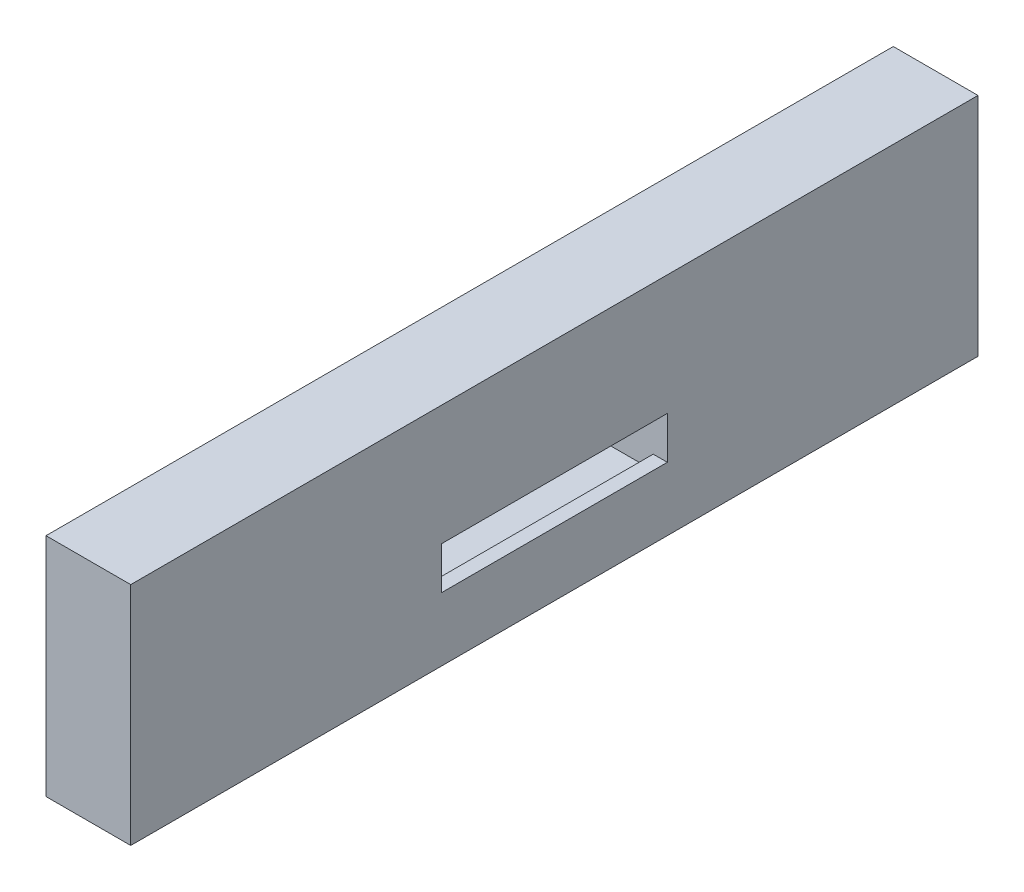
ISO-10303-21;
HEADER;
FILE_DESCRIPTION(('STEP AP214'),'2;1');
FILE_NAME('part.step','',(''),(''),'','','');
FILE_SCHEMA(('AUTOMOTIVE_DESIGN { 1 0 10303 214 1 1 1 1 }'));
ENDSEC;
DATA;
#1=APPLICATION_CONTEXT('core data for automotive mechanical design processes');
#2=APPLICATION_PROTOCOL_DEFINITION('international standard','automotive_design',2000,#1);
#3=PRODUCT_CONTEXT('',#1,'mechanical');
#4=PRODUCT('Part','Part','',(#3));
#5=PRODUCT_RELATED_PRODUCT_CATEGORY('part','',(#4));
#6=PRODUCT_DEFINITION_FORMATION('','',#4);
#7=PRODUCT_DEFINITION_CONTEXT('part definition',#1,'design');
#8=PRODUCT_DEFINITION('design','',#6,#7);
#9=PRODUCT_DEFINITION_SHAPE('','',#8);
#10=(LENGTH_UNIT() NAMED_UNIT(*) SI_UNIT(.MILLI.,.METRE.));
#11=(NAMED_UNIT(*) PLANE_ANGLE_UNIT() SI_UNIT($,.RADIAN.));
#12=(NAMED_UNIT(*) SI_UNIT($,.STERADIAN.) SOLID_ANGLE_UNIT());
#13=UNCERTAINTY_MEASURE_WITH_UNIT(LENGTH_MEASURE(1.E-05),#10,'distance_accuracy_value','');
#14=(GEOMETRIC_REPRESENTATION_CONTEXT(3) GLOBAL_UNCERTAINTY_ASSIGNED_CONTEXT((#13)) GLOBAL_UNIT_ASSIGNED_CONTEXT((#10,
#11,#12)) REPRESENTATION_CONTEXT('',''));
#15=CARTESIAN_POINT('',(0.,0.,0.));
#16=DIRECTION('',(0.,0.,1.));
#17=DIRECTION('',(1.,0.,0.));
#18=AXIS2_PLACEMENT_3D('',#15,#16,#17);
#19=CARTESIAN_POINT('',(63.5,0.,0.));
#20=DIRECTION('',(1.,0.,0.));
#21=DIRECTION('',(0.,0.,-1.));
#22=AXIS2_PLACEMENT_3D('',#19,#20,#21);
#23=PLANE('',#22);
#24=DIRECTION('',(0.,0.,1.));
#25=VECTOR('',#24,1.);
#26=CARTESIAN_POINT('',(63.5,57.15,-482.6));
#27=LINE('',#26,#25);
#28=CARTESIAN_POINT('',(63.5,57.15,-482.6));
#29=VERTEX_POINT('',#28);
#30=CARTESIAN_POINT('',(63.5,57.15,-279.4));
#31=VERTEX_POINT('',#30);
#32=EDGE_CURVE('E177',#29,#31,#27,.T.);
#33=ORIENTED_EDGE('',*,*,#32,.F.);
#34=DIRECTION('',(0.,-1.,0.));
#35=VECTOR('',#34,1.);
#36=CARTESIAN_POINT('',(63.5,44.45,-482.6));
#37=LINE('',#36,#35);
#38=CARTESIAN_POINT('',(63.5,44.45,-482.6));
#39=VERTEX_POINT('',#38);
#40=EDGE_CURVE('E152',#29,#39,#37,.T.);
#41=ORIENTED_EDGE('',*,*,#40,.T.);
#42=DIRECTION('',(0.,0.,1.));
#43=VECTOR('',#42,1.);
#44=CARTESIAN_POINT('',(63.5,44.45,-482.6));
#45=LINE('',#44,#43);
#46=CARTESIAN_POINT('',(63.5,44.45,-279.4));
#47=VERTEX_POINT('',#46);
#48=EDGE_CURVE('E198',#39,#47,#45,.T.);
#49=ORIENTED_EDGE('',*,*,#48,.T.);
#50=DIRECTION('',(0.,1.,0.));
#51=VECTOR('',#50,1.);
#52=CARTESIAN_POINT('',(63.5,44.45,-279.4));
#53=LINE('',#52,#51);
#54=EDGE_CURVE('E203',#47,#31,#53,.T.);
#55=ORIENTED_EDGE('',*,*,#54,.T.);
#56=EDGE_LOOP('',(#33,#41,#49,#55));
#57=FACE_BOUND('',#56,.T.);
#58=ADVANCED_FACE('F42',(#57),#23,.F.);
#59=CARTESIAN_POINT('',(63.5,95.25,-279.4));
#60=VERTEX_POINT('',#59);
#61=CARTESIAN_POINT('',(63.5,114.3,-279.4));
#62=VERTEX_POINT('',#61);
#63=EDGE_CURVE('E202',#60,#62,#53,.T.);
#64=ORIENTED_EDGE('',*,*,#63,.T.);
#65=CARTESIAN_POINT('',(63.5,114.3,-304.8));
#66=DIRECTION('',(1.,0.,0.));
#67=DIRECTION('',(0.,0.,-1.));
#68=AXIS2_PLACEMENT_3D('',#65,#66,#67);
#69=CIRCLE('',#68,25.4);
#70=CARTESIAN_POINT('',(63.5,139.7,-304.8));
#71=VERTEX_POINT('',#70);
#72=EDGE_CURVE('E285',#62,#71,#69,.F.);
#73=ORIENTED_EDGE('',*,*,#72,.T.);
#74=DIRECTION('',(0.,0.,-1.));
#75=VECTOR('',#74,1.);
#76=CARTESIAN_POINT('',(63.5,139.7,-482.6));
#77=LINE('',#76,#75);
#78=CARTESIAN_POINT('',(63.5,139.7,-457.2));
#79=VERTEX_POINT('',#78);
#80=EDGE_CURVE('E207',#71,#79,#77,.T.);
#81=ORIENTED_EDGE('',*,*,#80,.T.);
#82=CARTESIAN_POINT('',(63.5,114.3,-457.2));
#83=DIRECTION('',(1.,0.,0.));
#84=DIRECTION('',(0.,0.,-1.));
#85=AXIS2_PLACEMENT_3D('',#82,#83,#84);
#86=CIRCLE('',#85,25.4);
#87=CARTESIAN_POINT('',(63.5,114.3,-482.6));
#88=VERTEX_POINT('',#87);
#89=EDGE_CURVE('E64',#79,#88,#86,.F.);
#90=ORIENTED_EDGE('',*,*,#89,.T.);
#91=CARTESIAN_POINT('',(63.5,95.25,-482.6));
#92=VERTEX_POINT('',#91);
#93=EDGE_CURVE('E195',#88,#92,#37,.T.);
#94=ORIENTED_EDGE('',*,*,#93,.T.);
#95=DIRECTION('',(0.,0.,-1.));
#96=VECTOR('',#95,1.);
#97=CARTESIAN_POINT('',(63.5,95.25,-482.6));
#98=LINE('',#97,#96);
#99=EDGE_CURVE('E173',#60,#92,#98,.T.);
#100=ORIENTED_EDGE('',*,*,#99,.F.);
#101=EDGE_LOOP('',(#64,#73,#81,#90,#94,#100));
#102=FACE_BOUND('',#101,.T.);
#103=ADVANCED_FACE('F309',(#102),#23,.F.);
#104=CARTESIAN_POINT('',(76.2,0.,0.));
#105=DIRECTION('',(0.,0.,-1.));
#106=DIRECTION('',(-1.,0.,0.));
#107=AXIS2_PLACEMENT_3D('',#104,#105,#106);
#108=PLANE('',#107);
#109=DIRECTION('',(0.,-1.,0.));
#110=VECTOR('',#109,1.);
#111=CARTESIAN_POINT('',(0.,0.,0.));
#112=LINE('',#111,#110);
#113=CARTESIAN_POINT('',(0.,203.2,0.));
#114=VERTEX_POINT('',#113);
#115=CARTESIAN_POINT('',(0.,0.,0.));
#116=VERTEX_POINT('',#115);
#117=EDGE_CURVE('E228',#114,#116,#112,.T.);
#118=ORIENTED_EDGE('',*,*,#117,.T.);
#119=DIRECTION('',(-1.,0.,0.));
#120=VECTOR('',#119,1.);
#121=CARTESIAN_POINT('',(76.2,0.,0.));
#122=LINE('',#121,#120);
#123=CARTESIAN_POINT('',(76.2,0.,0.));
#124=VERTEX_POINT('',#123);
#125=EDGE_CURVE('E269',#124,#116,#122,.T.);
#126=ORIENTED_EDGE('',*,*,#125,.F.);
#127=DIRECTION('',(0.,-1.,0.));
#128=VECTOR('',#127,1.);
#129=CARTESIAN_POINT('',(76.2,0.,0.));
#130=LINE('',#129,#128);
#131=CARTESIAN_POINT('',(76.2,203.2,0.));
#132=VERTEX_POINT('',#131);
#133=EDGE_CURVE('E232',#132,#124,#130,.T.);
#134=ORIENTED_EDGE('',*,*,#133,.F.);
#135=DIRECTION('',(-1.,0.,0.));
#136=VECTOR('',#135,1.);
#137=CARTESIAN_POINT('',(76.2,203.2,0.));
#138=LINE('',#137,#136);
#139=EDGE_CURVE('E246',#132,#114,#138,.T.);
#140=ORIENTED_EDGE('',*,*,#139,.T.);
#141=EDGE_LOOP('',(#118,#126,#134,#140));
#142=FACE_BOUND('',#141,.T.);
#143=ADVANCED_FACE('F335',(#142),#108,.F.);
#144=CARTESIAN_POINT('',(76.2,0.,0.));
#145=DIRECTION('',(0.,1.,0.));
#146=DIRECTION('',(0.,0.,1.));
#147=AXIS2_PLACEMENT_3D('',#144,#145,#146);
#148=PLANE('',#147);
#149=DIRECTION('',(0.,0.,-1.));
#150=VECTOR('',#149,1.);
#151=CARTESIAN_POINT('',(0.,0.,0.));
#152=LINE('',#151,#150);
#153=CARTESIAN_POINT('',(0.,0.,-762.));
#154=VERTEX_POINT('',#153);
#155=EDGE_CURVE('E250',#116,#154,#152,.T.);
#156=ORIENTED_EDGE('',*,*,#155,.T.);
#157=DIRECTION('',(-1.,0.,0.));
#158=VECTOR('',#157,1.);
#159=CARTESIAN_POINT('',(76.2,0.,-762.));
#160=LINE('',#159,#158);
#161=CARTESIAN_POINT('',(76.2,0.,-762.));
#162=VERTEX_POINT('',#161);
#163=EDGE_CURVE('E265',#162,#154,#160,.T.);
#164=ORIENTED_EDGE('',*,*,#163,.F.);
#165=DIRECTION('',(0.,0.,-1.));
#166=VECTOR('',#165,1.);
#167=CARTESIAN_POINT('',(76.2,0.,0.));
#168=LINE('',#167,#166);
#169=EDGE_CURVE('E236',#124,#162,#168,.T.);
#170=ORIENTED_EDGE('',*,*,#169,.F.);
#171=ORIENTED_EDGE('',*,*,#125,.T.);
#172=EDGE_LOOP('',(#156,#164,#170,#171));
#173=FACE_BOUND('',#172,.T.);
#174=ADVANCED_FACE('F354',(#173),#148,.F.);
#175=CARTESIAN_POINT('',(76.2,0.,-762.));
#176=DIRECTION('',(0.,0.,1.));
#177=DIRECTION('',(0.,-1.,0.));
#178=AXIS2_PLACEMENT_3D('',#175,#176,#177);
#179=PLANE('',#178);
#180=DIRECTION('',(0.,1.,0.));
#181=VECTOR('',#180,1.);
#182=CARTESIAN_POINT('',(0.,0.,-762.));
#183=LINE('',#182,#181);
#184=CARTESIAN_POINT('',(0.,203.2,-762.));
#185=VERTEX_POINT('',#184);
#186=EDGE_CURVE('E253',#154,#185,#183,.T.);
#187=ORIENTED_EDGE('',*,*,#186,.T.);
#188=DIRECTION('',(-1.,0.,0.));
#189=VECTOR('',#188,1.);
#190=CARTESIAN_POINT('',(76.2,203.2,-762.));
#191=LINE('',#190,#189);
#192=CARTESIAN_POINT('',(76.2,203.2,-762.));
#193=VERTEX_POINT('',#192);
#194=EDGE_CURVE('E261',#193,#185,#191,.T.);
#195=ORIENTED_EDGE('',*,*,#194,.F.);
#196=DIRECTION('',(0.,1.,0.));
#197=VECTOR('',#196,1.);
#198=CARTESIAN_POINT('',(76.2,0.,-762.));
#199=LINE('',#198,#197);
#200=EDGE_CURVE('E240',#162,#193,#199,.T.);
#201=ORIENTED_EDGE('',*,*,#200,.F.);
#202=ORIENTED_EDGE('',*,*,#163,.T.);
#203=EDGE_LOOP('',(#187,#195,#201,#202));
#204=FACE_BOUND('',#203,.T.);
#205=ADVANCED_FACE('F350',(#204),#179,.F.);
#206=CARTESIAN_POINT('',(76.2,203.2,0.));
#207=DIRECTION('',(0.,-1.,0.));
#208=DIRECTION('',(0.,0.,-1.));
#209=AXIS2_PLACEMENT_3D('',#206,#207,#208);
#210=PLANE('',#209);
#211=DIRECTION('',(0.,0.,1.));
#212=VECTOR('',#211,1.);
#213=CARTESIAN_POINT('',(0.,203.2,0.));
#214=LINE('',#213,#212);
#215=EDGE_CURVE('E237',#185,#114,#214,.T.);
#216=ORIENTED_EDGE('',*,*,#215,.T.);
#217=ORIENTED_EDGE('',*,*,#139,.F.);
#218=DIRECTION('',(0.,0.,1.));
#219=VECTOR('',#218,1.);
#220=CARTESIAN_POINT('',(76.2,203.2,0.));
#221=LINE('',#220,#219);
#222=EDGE_CURVE('E243',#193,#132,#221,.T.);
#223=ORIENTED_EDGE('',*,*,#222,.F.);
#224=ORIENTED_EDGE('',*,*,#194,.T.);
#225=EDGE_LOOP('',(#216,#217,#223,#224));
#226=FACE_BOUND('',#225,.T.);
#227=ADVANCED_FACE('F345',(#226),#210,.F.);
#228=CARTESIAN_POINT('',(76.2,0.,0.));
#229=DIRECTION('',(-1.,0.,0.));
#230=DIRECTION('',(0.,0.,1.));
#231=AXIS2_PLACEMENT_3D('',#228,#229,#230);
#232=PLANE('',#231);
#233=DIRECTION('',(0.,0.,-1.));
#234=VECTOR('',#233,1.);
#235=CARTESIAN_POINT('',(76.2,95.25,-482.6));
#236=LINE('',#235,#234);
#237=CARTESIAN_POINT('',(76.2,95.25,-279.4));
#238=VERTEX_POINT('',#237);
#239=CARTESIAN_POINT('',(76.2,95.25,-482.6));
#240=VERTEX_POINT('',#239);
#241=EDGE_CURVE('E158',#238,#240,#236,.T.);
#242=ORIENTED_EDGE('',*,*,#241,.T.);
#243=DIRECTION('',(0.,-1.,0.));
#244=VECTOR('',#243,1.);
#245=CARTESIAN_POINT('',(76.2,95.25,-482.6));
#246=LINE('',#245,#244);
#247=CARTESIAN_POINT('',(76.2,57.15,-482.6));
#248=VERTEX_POINT('',#247);
#249=EDGE_CURVE('E149',#240,#248,#246,.T.);
#250=ORIENTED_EDGE('',*,*,#249,.T.);
#251=DIRECTION('',(0.,0.,1.));
#252=VECTOR('',#251,1.);
#253=CARTESIAN_POINT('',(76.2,57.15,-482.6));
#254=LINE('',#253,#252);
#255=CARTESIAN_POINT('',(76.2,57.15,-279.4));
#256=VERTEX_POINT('',#255);
#257=EDGE_CURVE('E162',#248,#256,#254,.T.);
#258=ORIENTED_EDGE('',*,*,#257,.T.);
#259=DIRECTION('',(0.,1.,0.));
#260=VECTOR('',#259,1.);
#261=CARTESIAN_POINT('',(76.2,95.25,-279.4));
#262=LINE('',#261,#260);
#263=EDGE_CURVE('E167',#256,#238,#262,.T.);
#264=ORIENTED_EDGE('',*,*,#263,.T.);
#265=EDGE_LOOP('',(#242,#250,#258,#264));
#266=FACE_BOUND('',#265,.T.);
#267=ORIENTED_EDGE('',*,*,#133,.T.);
#268=ORIENTED_EDGE('',*,*,#169,.T.);
#269=ORIENTED_EDGE('',*,*,#200,.T.);
#270=ORIENTED_EDGE('',*,*,#222,.T.);
#271=EDGE_LOOP('',(#267,#268,#269,#270));
#272=FACE_BOUND('',#271,.T.);
#273=ADVANCED_FACE('F169',(#266,#272),#232,.F.);
#274=CARTESIAN_POINT('',(0.,0.,0.));
#275=DIRECTION('',(-1.,0.,0.));
#276=DIRECTION('',(0.,0.,1.));
#277=AXIS2_PLACEMENT_3D('',#274,#275,#276);
#278=PLANE('',#277);
#279=DIRECTION('',(0.,-1.,0.));
#280=VECTOR('',#279,1.);
#281=CARTESIAN_POINT('',(0.,44.45,-482.6));
#282=LINE('',#281,#280);
#283=CARTESIAN_POINT('',(0.,114.3,-482.6));
#284=VERTEX_POINT('',#283);
#285=CARTESIAN_POINT('',(0.,44.45,-482.6));
#286=VERTEX_POINT('',#285);
#287=EDGE_CURVE('E189',#284,#286,#282,.T.);
#288=ORIENTED_EDGE('',*,*,#287,.F.);
#289=CARTESIAN_POINT('',(0.,114.3,-457.2));
#290=DIRECTION('',(-1.,0.,0.));
#291=DIRECTION('',(0.,0.,1.));
#292=AXIS2_PLACEMENT_3D('',#289,#290,#291);
#293=CIRCLE('',#292,25.4);
#294=CARTESIAN_POINT('',(0.,139.7,-457.2));
#295=VERTEX_POINT('',#294);
#296=EDGE_CURVE('E11',#284,#295,#293,.F.);
#297=ORIENTED_EDGE('',*,*,#296,.T.);
#298=DIRECTION('',(0.,0.,-1.));
#299=VECTOR('',#298,1.);
#300=CARTESIAN_POINT('',(0.,139.7,-482.6));
#301=LINE('',#300,#299);
#302=CARTESIAN_POINT('',(0.,139.7,-304.8));
#303=VERTEX_POINT('',#302);
#304=EDGE_CURVE('E221',#303,#295,#301,.T.);
#305=ORIENTED_EDGE('',*,*,#304,.F.);
#306=CARTESIAN_POINT('',(0.,114.3,-304.8));
#307=DIRECTION('',(-1.,0.,0.));
#308=DIRECTION('',(0.,0.,1.));
#309=AXIS2_PLACEMENT_3D('',#306,#307,#308);
#310=CIRCLE('',#309,25.4);
#311=CARTESIAN_POINT('',(0.,114.3,-279.4));
#312=VERTEX_POINT('',#311);
#313=EDGE_CURVE('E51',#303,#312,#310,.F.);
#314=ORIENTED_EDGE('',*,*,#313,.T.);
#315=DIRECTION('',(0.,1.,0.));
#316=VECTOR('',#315,1.);
#317=CARTESIAN_POINT('',(0.,44.45,-279.4));
#318=LINE('',#317,#316);
#319=CARTESIAN_POINT('',(0.,44.45,-279.4));
#320=VERTEX_POINT('',#319);
#321=EDGE_CURVE('E217',#320,#312,#318,.T.);
#322=ORIENTED_EDGE('',*,*,#321,.F.);
#323=DIRECTION('',(0.,0.,1.));
#324=VECTOR('',#323,1.);
#325=CARTESIAN_POINT('',(0.,44.45,-482.6));
#326=LINE('',#325,#324);
#327=EDGE_CURVE('E213',#286,#320,#326,.T.);
#328=ORIENTED_EDGE('',*,*,#327,.F.);
#329=EDGE_LOOP('',(#288,#297,#305,#314,#322,#328));
#330=FACE_BOUND('',#329,.T.);
#331=ORIENTED_EDGE('',*,*,#117,.F.);
#332=ORIENTED_EDGE('',*,*,#215,.F.);
#333=ORIENTED_EDGE('',*,*,#186,.F.);
#334=ORIENTED_EDGE('',*,*,#155,.F.);
#335=EDGE_LOOP('',(#331,#332,#333,#334));
#336=FACE_BOUND('',#335,.T.);
#337=ADVANCED_FACE('F295',(#330,#336),#278,.T.);
#338=CARTESIAN_POINT('',(63.5,44.45,-482.6));
#339=DIRECTION('',(0.,0.,-1.));
#340=DIRECTION('',(-1.,0.,0.));
#341=AXIS2_PLACEMENT_3D('',#338,#339,#340);
#342=PLANE('',#341);
#343=ORIENTED_EDGE('',*,*,#93,.F.);
#344=DIRECTION('',(-1.,0.,0.));
#345=VECTOR('',#344,1.);
#346=CARTESIAN_POINT('',(0.,114.3,-482.6));
#347=LINE('',#346,#345);
#348=EDGE_CURVE('E288',#88,#284,#347,.T.);
#349=ORIENTED_EDGE('',*,*,#348,.T.);
#350=ORIENTED_EDGE('',*,*,#287,.T.);
#351=DIRECTION('',(-1.,0.,0.));
#352=VECTOR('',#351,1.);
#353=CARTESIAN_POINT('',(63.5,44.45,-482.6));
#354=LINE('',#353,#352);
#355=EDGE_CURVE('E210',#39,#286,#354,.T.);
#356=ORIENTED_EDGE('',*,*,#355,.F.);
#357=ORIENTED_EDGE('',*,*,#40,.F.);
#358=DIRECTION('',(-1.,0.,0.));
#359=VECTOR('',#358,1.);
#360=CARTESIAN_POINT('',(76.2,57.15,-482.6));
#361=LINE('',#360,#359);
#362=EDGE_CURVE('E144',#248,#29,#361,.T.);
#363=ORIENTED_EDGE('',*,*,#362,.F.);
#364=ORIENTED_EDGE('',*,*,#249,.F.);
#365=DIRECTION('',(-1.,0.,0.));
#366=VECTOR('',#365,1.);
#367=CARTESIAN_POINT('',(76.2,95.25,-482.6));
#368=LINE('',#367,#366);
#369=EDGE_CURVE('E186',#240,#92,#368,.T.);
#370=ORIENTED_EDGE('',*,*,#369,.T.);
#371=EDGE_LOOP('',(#343,#349,#350,#356,#357,#363,#364,#370));
#372=FACE_BOUND('',#371,.T.);
#373=ADVANCED_FACE('F146',(#372),#342,.F.);
#374=CARTESIAN_POINT('',(63.5,139.7,-482.6));
#375=DIRECTION('',(0.,1.,0.));
#376=DIRECTION('',(0.,0.,1.));
#377=AXIS2_PLACEMENT_3D('',#374,#375,#376);
#378=PLANE('',#377);
#379=ORIENTED_EDGE('',*,*,#80,.F.);
#380=DIRECTION('',(-1.,0.,0.));
#381=VECTOR('',#380,1.);
#382=CARTESIAN_POINT('',(0.,139.7,-304.8));
#383=LINE('',#382,#381);
#384=EDGE_CURVE('E276',#71,#303,#383,.T.);
#385=ORIENTED_EDGE('',*,*,#384,.T.);
#386=ORIENTED_EDGE('',*,*,#304,.T.);
#387=DIRECTION('',(-1.,0.,0.));
#388=VECTOR('',#387,1.);
#389=CARTESIAN_POINT('',(63.5,139.7,-457.2));
#390=LINE('',#389,#388);
#391=EDGE_CURVE('E273',#295,#79,#390,.F.);
#392=ORIENTED_EDGE('',*,*,#391,.T.);
#393=EDGE_LOOP('',(#379,#385,#386,#392));
#394=FACE_BOUND('',#393,.T.);
#395=ADVANCED_FACE('F312',(#394),#378,.F.);
#396=CARTESIAN_POINT('',(63.5,44.45,-279.4));
#397=DIRECTION('',(0.,0.,1.));
#398=DIRECTION('',(0.,-1.,0.));
#399=AXIS2_PLACEMENT_3D('',#396,#397,#398);
#400=PLANE('',#399);
#401=ORIENTED_EDGE('',*,*,#321,.T.);
#402=DIRECTION('',(-1.,0.,0.));
#403=VECTOR('',#402,1.);
#404=CARTESIAN_POINT('',(63.5,114.3,-279.4));
#405=LINE('',#404,#403);
#406=EDGE_CURVE('E280',#312,#62,#405,.F.);
#407=ORIENTED_EDGE('',*,*,#406,.T.);
#408=ORIENTED_EDGE('',*,*,#63,.F.);
#409=DIRECTION('',(-1.,0.,0.));
#410=VECTOR('',#409,1.);
#411=CARTESIAN_POINT('',(76.2,95.25,-279.4));
#412=LINE('',#411,#410);
#413=EDGE_CURVE('E190',#238,#60,#412,.T.);
#414=ORIENTED_EDGE('',*,*,#413,.F.);
#415=ORIENTED_EDGE('',*,*,#263,.F.);
#416=DIRECTION('',(-1.,0.,0.));
#417=VECTOR('',#416,1.);
#418=CARTESIAN_POINT('',(76.2,57.15,-279.4));
#419=LINE('',#418,#417);
#420=EDGE_CURVE('E157',#256,#31,#419,.T.);
#421=ORIENTED_EDGE('',*,*,#420,.T.);
#422=ORIENTED_EDGE('',*,*,#54,.F.);
#423=DIRECTION('',(-1.,0.,0.));
#424=VECTOR('',#423,1.);
#425=CARTESIAN_POINT('',(63.5,44.45,-279.4));
#426=LINE('',#425,#424);
#427=EDGE_CURVE('E225',#47,#320,#426,.T.);
#428=ORIENTED_EDGE('',*,*,#427,.T.);
#429=EDGE_LOOP('',(#401,#407,#408,#414,#415,#421,#422,#428));
#430=FACE_BOUND('',#429,.T.);
#431=ADVANCED_FACE('F302',(#430),#400,.F.);
#432=CARTESIAN_POINT('',(63.5,44.45,-482.6));
#433=DIRECTION('',(0.,-1.,0.));
#434=DIRECTION('',(0.,0.,-1.));
#435=AXIS2_PLACEMENT_3D('',#432,#433,#434);
#436=PLANE('',#435);
#437=ORIENTED_EDGE('',*,*,#327,.T.);
#438=ORIENTED_EDGE('',*,*,#427,.F.);
#439=ORIENTED_EDGE('',*,*,#48,.F.);
#440=ORIENTED_EDGE('',*,*,#355,.T.);
#441=EDGE_LOOP('',(#437,#438,#439,#440));
#442=FACE_BOUND('',#441,.T.);
#443=ADVANCED_FACE('F314',(#442),#436,.F.);
#444=CARTESIAN_POINT('',(76.2,95.25,-482.6));
#445=DIRECTION('',(0.,1.,0.));
#446=DIRECTION('',(0.,0.,1.));
#447=AXIS2_PLACEMENT_3D('',#444,#445,#446);
#448=PLANE('',#447);
#449=ORIENTED_EDGE('',*,*,#99,.T.);
#450=ORIENTED_EDGE('',*,*,#369,.F.);
#451=ORIENTED_EDGE('',*,*,#241,.F.);
#452=ORIENTED_EDGE('',*,*,#413,.T.);
#453=EDGE_LOOP('',(#449,#450,#451,#452));
#454=FACE_BOUND('',#453,.T.);
#455=ADVANCED_FACE('F320',(#454),#448,.F.);
#456=CARTESIAN_POINT('',(76.2,57.15,-482.6));
#457=DIRECTION('',(0.,-1.,0.));
#458=DIRECTION('',(0.,0.,-1.));
#459=AXIS2_PLACEMENT_3D('',#456,#457,#458);
#460=PLANE('',#459);
#461=ORIENTED_EDGE('',*,*,#32,.T.);
#462=ORIENTED_EDGE('',*,*,#420,.F.);
#463=ORIENTED_EDGE('',*,*,#257,.F.);
#464=ORIENTED_EDGE('',*,*,#362,.T.);
#465=EDGE_LOOP('',(#461,#462,#463,#464));
#466=FACE_BOUND('',#465,.T.);
#467=ADVANCED_FACE('F163',(#466),#460,.F.);
#468=CARTESIAN_POINT('',(63.5,114.3,-304.8));
#469=DIRECTION('',(1.,0.,0.));
#470=DIRECTION('',(0.,0.,-1.));
#471=AXIS2_PLACEMENT_3D('',#468,#469,#470);
#472=CYLINDRICAL_SURFACE('',#471,25.4);
#473=ORIENTED_EDGE('',*,*,#72,.F.);
#474=ORIENTED_EDGE('',*,*,#406,.F.);
#475=ORIENTED_EDGE('',*,*,#313,.F.);
#476=ORIENTED_EDGE('',*,*,#384,.F.);
#477=EDGE_LOOP('',(#473,#474,#475,#476));
#478=FACE_BOUND('',#477,.T.);
#479=ADVANCED_FACE('F307',(#478),#472,.F.);
#480=CARTESIAN_POINT('',(63.5,114.3,-457.2));
#481=DIRECTION('',(1.,0.,0.));
#482=DIRECTION('',(0.,0.,-1.));
#483=AXIS2_PLACEMENT_3D('',#480,#481,#482);
#484=CYLINDRICAL_SURFACE('',#483,25.4);
#485=ORIENTED_EDGE('',*,*,#89,.F.);
#486=ORIENTED_EDGE('',*,*,#391,.F.);
#487=ORIENTED_EDGE('',*,*,#296,.F.);
#488=ORIENTED_EDGE('',*,*,#348,.F.);
#489=EDGE_LOOP('',(#485,#486,#487,#488));
#490=FACE_BOUND('',#489,.T.);
#491=ADVANCED_FACE('F44',(#490),#484,.F.);
#492=CLOSED_SHELL('',(#58,#103,#143,#174,#205,#227,#273,#337,#373,#395,#431,#443,#455,#467,#479,#491));
#493=MANIFOLD_SOLID_BREP('B2',#492);
#494=ADVANCED_BREP_SHAPE_REPRESENTATION('',(#18,#493),#14);
#495=SHAPE_DEFINITION_REPRESENTATION(#9,#494);
ENDSEC;
END-ISO-10303-21;
